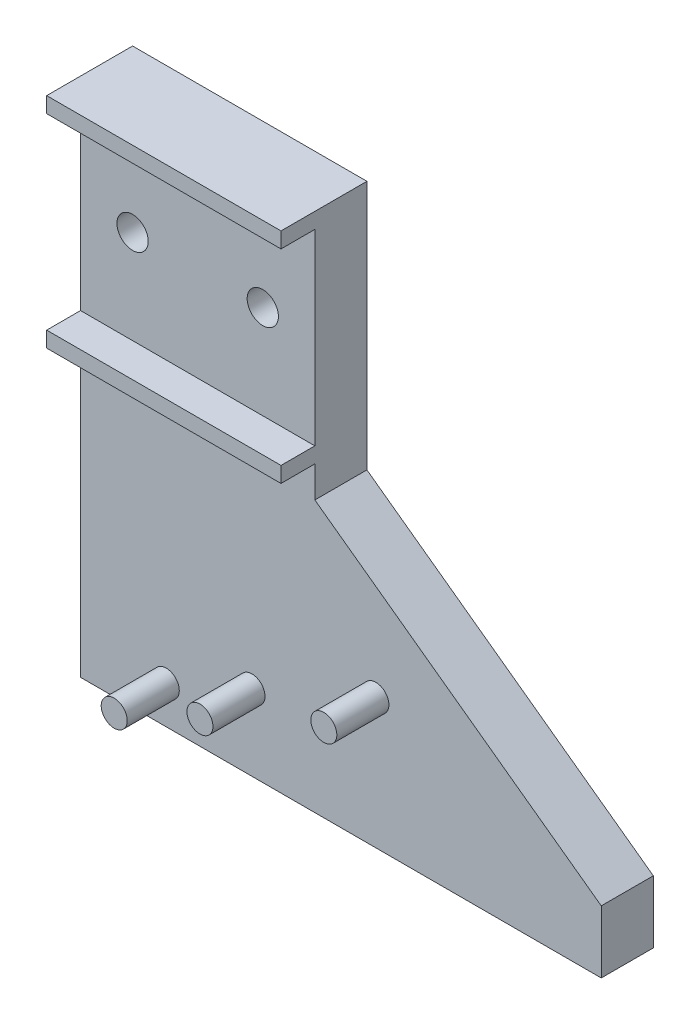
ISO-10303-21;
HEADER;
FILE_DESCRIPTION(('STEP AP214'),'2;1');
FILE_NAME('part.step','',(''),(''),'','','');
FILE_SCHEMA(('AUTOMOTIVE_DESIGN { 1 0 10303 214 1 1 1 1 }'));
ENDSEC;
DATA;
#1=APPLICATION_CONTEXT('core data for automotive mechanical design processes');
#2=APPLICATION_PROTOCOL_DEFINITION('international standard','automotive_design',2000,#1);
#3=PRODUCT_CONTEXT('',#1,'mechanical');
#4=PRODUCT('Part','Part','',(#3));
#5=PRODUCT_RELATED_PRODUCT_CATEGORY('part','',(#4));
#6=PRODUCT_DEFINITION_FORMATION('','',#4);
#7=PRODUCT_DEFINITION_CONTEXT('part definition',#1,'design');
#8=PRODUCT_DEFINITION('design','',#6,#7);
#9=PRODUCT_DEFINITION_SHAPE('','',#8);
#10=(LENGTH_UNIT() NAMED_UNIT(*) SI_UNIT(.MILLI.,.METRE.));
#11=(NAMED_UNIT(*) PLANE_ANGLE_UNIT() SI_UNIT($,.RADIAN.));
#12=(NAMED_UNIT(*) SI_UNIT($,.STERADIAN.) SOLID_ANGLE_UNIT());
#13=UNCERTAINTY_MEASURE_WITH_UNIT(LENGTH_MEASURE(1.E-05),#10,'distance_accuracy_value','');
#14=(GEOMETRIC_REPRESENTATION_CONTEXT(3) GLOBAL_UNCERTAINTY_ASSIGNED_CONTEXT((#13)) GLOBAL_UNIT_ASSIGNED_CONTEXT((#10,
#11,#12)) REPRESENTATION_CONTEXT('',''));
#15=CARTESIAN_POINT('',(0.,0.,0.));
#16=DIRECTION('',(0.,0.,1.));
#17=DIRECTION('',(1.,0.,0.));
#18=AXIS2_PLACEMENT_3D('',#15,#16,#17);
#19=CARTESIAN_POINT('',(0.,0.,0.));
#20=DIRECTION('',(0.,0.,1.));
#21=DIRECTION('',(1.,0.,0.));
#22=AXIS2_PLACEMENT_3D('',#19,#20,#21);
#23=PLANE('',#22);
#24=CARTESIAN_POINT('',(56.7206540357554,25.0353231606093,0.));
#25=DIRECTION('',(0.,0.,1.));
#26=DIRECTION('',(1.,0.,0.));
#27=AXIS2_PLACEMENT_3D('',#24,#25,#26);
#28=CIRCLE('',#27,2.5);
#29=CARTESIAN_POINT('',(59.2206540357554,25.0353231606093,0.));
#30=VERTEX_POINT('',#29);
#31=EDGE_CURVE('E249',#30,#30,#28,.T.);
#32=ORIENTED_EDGE('',*,*,#31,.F.);
#33=EDGE_LOOP('',(#32));
#34=FACE_BOUND('',#33,.T.);
#35=CARTESIAN_POINT('',(32.9345733110838,14.5366392545473,0.));
#36=DIRECTION('',(0.,0.,1.));
#37=DIRECTION('',(1.,0.,0.));
#38=AXIS2_PLACEMENT_3D('',#35,#36,#37);
#39=CIRCLE('',#38,2.5);
#40=CARTESIAN_POINT('',(35.4345733110838,14.5366392545473,0.));
#41=VERTEX_POINT('',#40);
#42=EDGE_CURVE('E243',#41,#41,#39,.T.);
#43=ORIENTED_EDGE('',*,*,#42,.F.);
#44=EDGE_LOOP('',(#43));
#45=FACE_BOUND('',#44,.T.);
#46=CARTESIAN_POINT('',(16.4672866555419,7.26831962727367,0.));
#47=DIRECTION('',(0.,0.,1.));
#48=DIRECTION('',(1.,0.,0.));
#49=AXIS2_PLACEMENT_3D('',#46,#47,#48);
#50=CIRCLE('',#49,2.5);
#51=CARTESIAN_POINT('',(18.9672866555419,7.26831962727367,0.));
#52=VERTEX_POINT('',#51);
#53=EDGE_CURVE('E237',#52,#52,#50,.T.);
#54=ORIENTED_EDGE('',*,*,#53,.F.);
#55=EDGE_LOOP('',(#54));
#56=FACE_BOUND('',#55,.T.);
#57=DIRECTION('',(0.,1.,0.));
#58=VECTOR('',#57,1.);
#59=CARTESIAN_POINT('',(45.,52.,0.));
#60=LINE('',#59,#58);
#61=CARTESIAN_POINT('',(45.,52.,0.));
#62=VERTEX_POINT('',#61);
#63=CARTESIAN_POINT('',(45.,58.,0.));
#64=VERTEX_POINT('',#63);
#65=EDGE_CURVE('E174',#62,#64,#60,.T.);
#66=ORIENTED_EDGE('',*,*,#65,.T.);
#67=DIRECTION('',(1.,0.,0.));
#68=VECTOR('',#67,1.);
#69=CARTESIAN_POINT('',(0.,58.,0.));
#70=LINE('',#69,#68);
#71=CARTESIAN_POINT('',(0.,58.,0.));
#72=VERTEX_POINT('',#71);
#73=EDGE_CURVE('E215',#72,#64,#70,.T.);
#74=ORIENTED_EDGE('',*,*,#73,.F.);
#75=DIRECTION('',(0.,-1.,0.));
#76=VECTOR('',#75,1.);
#77=CARTESIAN_POINT('',(0.,100.,0.));
#78=LINE('',#77,#76);
#79=CARTESIAN_POINT('',(0.,0.,0.));
#80=VERTEX_POINT('',#79);
#81=EDGE_CURVE('E147',#72,#80,#78,.T.);
#82=ORIENTED_EDGE('',*,*,#81,.T.);
#83=DIRECTION('',(1.,0.,0.));
#84=VECTOR('',#83,1.);
#85=CARTESIAN_POINT('',(0.,0.,0.));
#86=LINE('',#85,#84);
#87=CARTESIAN_POINT('',(100.,0.,0.));
#88=VERTEX_POINT('',#87);
#89=EDGE_CURVE('E191',#80,#88,#86,.T.);
#90=ORIENTED_EDGE('',*,*,#89,.T.);
#91=DIRECTION('',(0.,1.,0.));
#92=VECTOR('',#91,1.);
#93=CARTESIAN_POINT('',(100.,0.,0.));
#94=LINE('',#93,#92);
#95=CARTESIAN_POINT('',(100.,12.,0.));
#96=VERTEX_POINT('',#95);
#97=EDGE_CURVE('E194',#88,#96,#94,.T.);
#98=ORIENTED_EDGE('',*,*,#97,.T.);
#99=DIRECTION('',(-0.808736084303189,0.588171697675046,0.));
#100=VECTOR('',#99,1.);
#101=CARTESIAN_POINT('',(100.,12.,0.));
#102=LINE('',#101,#100);
#103=EDGE_CURVE('E197',#96,#62,#102,.T.);
#104=ORIENTED_EDGE('',*,*,#103,.T.);
#105=EDGE_LOOP('',(#66,#74,#82,#90,#98,#104));
#106=FACE_BOUND('',#105,.T.);
#107=ADVANCED_FACE('F33',(#34,#45,#56,#106),#23,.T.);
#108=CARTESIAN_POINT('',(10.,79.,0.));
#109=DIRECTION('',(0.,0.,1.));
#110=DIRECTION('',(1.,0.,0.));
#111=AXIS2_PLACEMENT_3D('',#108,#109,#110);
#112=CIRCLE('',#111,3.);
#113=CARTESIAN_POINT('',(13.,79.,0.));
#114=VERTEX_POINT('',#113);
#115=EDGE_CURVE('E221',#114,#114,#112,.T.);
#116=ORIENTED_EDGE('',*,*,#115,.F.);
#117=EDGE_LOOP('',(#116));
#118=FACE_BOUND('',#117,.T.);
#119=CARTESIAN_POINT('',(35.,79.,0.));
#120=DIRECTION('',(0.,0.,1.));
#121=DIRECTION('',(1.,0.,0.));
#122=AXIS2_PLACEMENT_3D('',#119,#120,#121);
#123=CIRCLE('',#122,3.);
#124=CARTESIAN_POINT('',(38.,79.,0.));
#125=VERTEX_POINT('',#124);
#126=EDGE_CURVE('E231',#125,#125,#123,.T.);
#127=ORIENTED_EDGE('',*,*,#126,.F.);
#128=EDGE_LOOP('',(#127));
#129=FACE_BOUND('',#128,.T.);
#130=CARTESIAN_POINT('',(0.,97.,0.));
#131=VERTEX_POINT('',#130);
#132=CARTESIAN_POINT('',(0.,61.,0.));
#133=VERTEX_POINT('',#132);
#134=EDGE_CURVE('E189',#131,#133,#78,.T.);
#135=ORIENTED_EDGE('',*,*,#134,.T.);
#136=DIRECTION('',(-1.,0.,0.));
#137=VECTOR('',#136,1.);
#138=CARTESIAN_POINT('',(0.,61.,0.));
#139=LINE('',#138,#137);
#140=CARTESIAN_POINT('',(45.,61.,0.));
#141=VERTEX_POINT('',#140);
#142=EDGE_CURVE('E143',#141,#133,#139,.T.);
#143=ORIENTED_EDGE('',*,*,#142,.F.);
#144=CARTESIAN_POINT('',(45.,97.,0.));
#145=VERTEX_POINT('',#144);
#146=EDGE_CURVE('E200',#141,#145,#60,.T.);
#147=ORIENTED_EDGE('',*,*,#146,.T.);
#148=DIRECTION('',(1.,0.,0.));
#149=VECTOR('',#148,1.);
#150=CARTESIAN_POINT('',(0.,97.,0.));
#151=LINE('',#150,#149);
#152=EDGE_CURVE('E58',#131,#145,#151,.T.);
#153=ORIENTED_EDGE('',*,*,#152,.F.);
#154=EDGE_LOOP('',(#135,#143,#147,#153));
#155=FACE_BOUND('',#154,.T.);
#156=ADVANCED_FACE('F266',(#118,#129,#155),#23,.T.);
#157=CARTESIAN_POINT('',(0.,100.,-10.));
#158=DIRECTION('',(-1.,0.,0.));
#159=DIRECTION('',(0.,0.,1.));
#160=AXIS2_PLACEMENT_3D('',#157,#158,#159);
#161=PLANE('',#160);
#162=ORIENTED_EDGE('',*,*,#134,.F.);
#163=DIRECTION('',(0.,0.,-1.));
#164=VECTOR('',#163,1.);
#165=CARTESIAN_POINT('',(0.,97.,6.5));
#166=LINE('',#165,#164);
#167=CARTESIAN_POINT('',(0.,97.,6.5));
#168=VERTEX_POINT('',#167);
#169=EDGE_CURVE('E167',#168,#131,#166,.T.);
#170=ORIENTED_EDGE('',*,*,#169,.F.);
#171=DIRECTION('',(0.,-1.,0.));
#172=VECTOR('',#171,1.);
#173=CARTESIAN_POINT('',(0.,100.,6.5));
#174=LINE('',#173,#172);
#175=CARTESIAN_POINT('',(0.,100.,6.5));
#176=VERTEX_POINT('',#175);
#177=EDGE_CURVE('E149',#176,#168,#174,.T.);
#178=ORIENTED_EDGE('',*,*,#177,.F.);
#179=DIRECTION('',(0.,0.,1.));
#180=VECTOR('',#179,1.);
#181=CARTESIAN_POINT('',(0.,100.,-10.));
#182=LINE('',#181,#180);
#183=CARTESIAN_POINT('',(0.,100.,-10.));
#184=VERTEX_POINT('',#183);
#185=EDGE_CURVE('E11',#184,#176,#182,.T.);
#186=ORIENTED_EDGE('',*,*,#185,.F.);
#187=DIRECTION('',(0.,-1.,0.));
#188=VECTOR('',#187,1.);
#189=CARTESIAN_POINT('',(0.,100.,-10.));
#190=LINE('',#189,#188);
#191=CARTESIAN_POINT('',(0.,0.,-10.));
#192=VERTEX_POINT('',#191);
#193=EDGE_CURVE('E170',#184,#192,#190,.T.);
#194=ORIENTED_EDGE('',*,*,#193,.T.);
#195=DIRECTION('',(0.,0.,1.));
#196=VECTOR('',#195,1.);
#197=CARTESIAN_POINT('',(0.,0.,-10.));
#198=LINE('',#197,#196);
#199=EDGE_CURVE('E37',#192,#80,#198,.T.);
#200=ORIENTED_EDGE('',*,*,#199,.T.);
#201=ORIENTED_EDGE('',*,*,#81,.F.);
#202=DIRECTION('',(0.,0.,-1.));
#203=VECTOR('',#202,1.);
#204=CARTESIAN_POINT('',(0.,58.,6.5));
#205=LINE('',#204,#203);
#206=CARTESIAN_POINT('',(0.,58.,6.5));
#207=VERTEX_POINT('',#206);
#208=EDGE_CURVE('E128',#207,#72,#205,.T.);
#209=ORIENTED_EDGE('',*,*,#208,.F.);
#210=DIRECTION('',(0.,-1.,0.));
#211=VECTOR('',#210,1.);
#212=CARTESIAN_POINT('',(0.,61.,6.5));
#213=LINE('',#212,#211);
#214=CARTESIAN_POINT('',(0.,61.,6.5));
#215=VERTEX_POINT('',#214);
#216=EDGE_CURVE('E135',#215,#207,#213,.T.);
#217=ORIENTED_EDGE('',*,*,#216,.F.);
#218=DIRECTION('',(0.,0.,-1.));
#219=VECTOR('',#218,1.);
#220=CARTESIAN_POINT('',(0.,61.,6.5));
#221=LINE('',#220,#219);
#222=EDGE_CURVE('E226',#215,#133,#221,.T.);
#223=ORIENTED_EDGE('',*,*,#222,.T.);
#224=EDGE_LOOP('',(#162,#170,#178,#186,#194,#200,#201,#209,#217,#223));
#225=FACE_BOUND('',#224,.T.);
#226=ADVANCED_FACE('F35',(#225),#161,.T.);
#227=CARTESIAN_POINT('',(45.,100.,-10.));
#228=DIRECTION('',(0.,1.,0.));
#229=DIRECTION('',(0.,0.,1.));
#230=AXIS2_PLACEMENT_3D('',#227,#228,#229);
#231=PLANE('',#230);
#232=ORIENTED_EDGE('',*,*,#185,.T.);
#233=DIRECTION('',(-1.,0.,0.));
#234=VECTOR('',#233,1.);
#235=CARTESIAN_POINT('',(0.,100.,6.5));
#236=LINE('',#235,#234);
#237=CARTESIAN_POINT('',(45.,100.,6.5));
#238=VERTEX_POINT('',#237);
#239=EDGE_CURVE('E161',#238,#176,#236,.T.);
#240=ORIENTED_EDGE('',*,*,#239,.F.);
#241=DIRECTION('',(0.,0.,1.));
#242=VECTOR('',#241,1.);
#243=CARTESIAN_POINT('',(45.,100.,-10.));
#244=LINE('',#243,#242);
#245=CARTESIAN_POINT('',(45.,100.,-10.));
#246=VERTEX_POINT('',#245);
#247=EDGE_CURVE('E42',#246,#238,#244,.T.);
#248=ORIENTED_EDGE('',*,*,#247,.F.);
#249=DIRECTION('',(-1.,0.,0.));
#250=VECTOR('',#249,1.);
#251=CARTESIAN_POINT('',(45.,100.,-10.));
#252=LINE('',#251,#250);
#253=EDGE_CURVE('E186',#246,#184,#252,.T.);
#254=ORIENTED_EDGE('',*,*,#253,.T.);
#255=EDGE_LOOP('',(#232,#240,#248,#254));
#256=FACE_BOUND('',#255,.T.);
#257=ADVANCED_FACE('F313',(#256),#231,.T.);
#258=CARTESIAN_POINT('',(45.,52.,-10.));
#259=DIRECTION('',(1.,0.,0.));
#260=DIRECTION('',(0.,0.,-1.));
#261=AXIS2_PLACEMENT_3D('',#258,#259,#260);
#262=PLANE('',#261);
#263=ORIENTED_EDGE('',*,*,#65,.F.);
#264=DIRECTION('',(0.,0.,1.));
#265=VECTOR('',#264,1.);
#266=CARTESIAN_POINT('',(45.,52.,-10.));
#267=LINE('',#266,#265);
#268=CARTESIAN_POINT('',(45.,52.,-10.));
#269=VERTEX_POINT('',#268);
#270=EDGE_CURVE('E204',#269,#62,#267,.T.);
#271=ORIENTED_EDGE('',*,*,#270,.F.);
#272=DIRECTION('',(0.,1.,0.));
#273=VECTOR('',#272,1.);
#274=CARTESIAN_POINT('',(45.,52.,-10.));
#275=LINE('',#274,#273);
#276=EDGE_CURVE('E183',#269,#246,#275,.T.);
#277=ORIENTED_EDGE('',*,*,#276,.T.);
#278=ORIENTED_EDGE('',*,*,#247,.T.);
#279=DIRECTION('',(0.,1.,0.));
#280=VECTOR('',#279,1.);
#281=CARTESIAN_POINT('',(45.,100.,6.5));
#282=LINE('',#281,#280);
#283=CARTESIAN_POINT('',(45.,97.,6.5));
#284=VERTEX_POINT('',#283);
#285=EDGE_CURVE('E158',#284,#238,#282,.T.);
#286=ORIENTED_EDGE('',*,*,#285,.F.);
#287=DIRECTION('',(0.,0.,-1.));
#288=VECTOR('',#287,1.);
#289=CARTESIAN_POINT('',(45.,97.,6.5));
#290=LINE('',#289,#288);
#291=EDGE_CURVE('E163',#284,#145,#290,.T.);
#292=ORIENTED_EDGE('',*,*,#291,.T.);
#293=ORIENTED_EDGE('',*,*,#146,.F.);
#294=DIRECTION('',(0.,0.,-1.));
#295=VECTOR('',#294,1.);
#296=CARTESIAN_POINT('',(45.,61.,6.5));
#297=LINE('',#296,#295);
#298=CARTESIAN_POINT('',(45.,61.,6.5));
#299=VERTEX_POINT('',#298);
#300=EDGE_CURVE('E50',#299,#141,#297,.T.);
#301=ORIENTED_EDGE('',*,*,#300,.F.);
#302=DIRECTION('',(0.,1.,0.));
#303=VECTOR('',#302,1.);
#304=CARTESIAN_POINT('',(45.,61.,6.5));
#305=LINE('',#304,#303);
#306=CARTESIAN_POINT('',(45.,58.,6.5));
#307=VERTEX_POINT('',#306);
#308=EDGE_CURVE('E134',#307,#299,#305,.T.);
#309=ORIENTED_EDGE('',*,*,#308,.F.);
#310=DIRECTION('',(0.,0.,-1.));
#311=VECTOR('',#310,1.);
#312=CARTESIAN_POINT('',(45.,58.,6.5));
#313=LINE('',#312,#311);
#314=EDGE_CURVE('E131',#307,#64,#313,.T.);
#315=ORIENTED_EDGE('',*,*,#314,.T.);
#316=EDGE_LOOP('',(#263,#271,#277,#278,#286,#292,#293,#301,#309,#315));
#317=FACE_BOUND('',#316,.T.);
#318=ADVANCED_FACE('F316',(#317),#262,.T.);
#319=CARTESIAN_POINT('',(100.,12.,-10.));
#320=DIRECTION('',(0.588171697675046,0.808736084303189,0.));
#321=DIRECTION('',(-0.808736084303189,0.588171697675046,0.));
#322=AXIS2_PLACEMENT_3D('',#319,#320,#321);
#323=PLANE('',#322);
#324=ORIENTED_EDGE('',*,*,#103,.F.);
#325=DIRECTION('',(0.,0.,1.));
#326=VECTOR('',#325,1.);
#327=CARTESIAN_POINT('',(100.,12.,-10.));
#328=LINE('',#327,#326);
#329=CARTESIAN_POINT('',(100.,12.,-10.));
#330=VERTEX_POINT('',#329);
#331=EDGE_CURVE('E206',#330,#96,#328,.T.);
#332=ORIENTED_EDGE('',*,*,#331,.F.);
#333=DIRECTION('',(-0.808736084303189,0.588171697675046,0.));
#334=VECTOR('',#333,1.);
#335=CARTESIAN_POINT('',(100.,12.,-10.));
#336=LINE('',#335,#334);
#337=EDGE_CURVE('E180',#330,#269,#336,.T.);
#338=ORIENTED_EDGE('',*,*,#337,.T.);
#339=ORIENTED_EDGE('',*,*,#270,.T.);
#340=EDGE_LOOP('',(#324,#332,#338,#339));
#341=FACE_BOUND('',#340,.T.);
#342=ADVANCED_FACE('F320',(#341),#323,.T.);
#343=CARTESIAN_POINT('',(100.,0.,-10.));
#344=DIRECTION('',(1.,0.,0.));
#345=DIRECTION('',(0.,0.,-1.));
#346=AXIS2_PLACEMENT_3D('',#343,#344,#345);
#347=PLANE('',#346);
#348=ORIENTED_EDGE('',*,*,#97,.F.);
#349=DIRECTION('',(0.,0.,1.));
#350=VECTOR('',#349,1.);
#351=CARTESIAN_POINT('',(100.,0.,-10.));
#352=LINE('',#351,#350);
#353=CARTESIAN_POINT('',(100.,0.,-10.));
#354=VERTEX_POINT('',#353);
#355=EDGE_CURVE('E207',#354,#88,#352,.T.);
#356=ORIENTED_EDGE('',*,*,#355,.F.);
#357=DIRECTION('',(0.,1.,0.));
#358=VECTOR('',#357,1.);
#359=CARTESIAN_POINT('',(100.,0.,-10.));
#360=LINE('',#359,#358);
#361=EDGE_CURVE('E177',#354,#330,#360,.T.);
#362=ORIENTED_EDGE('',*,*,#361,.T.);
#363=ORIENTED_EDGE('',*,*,#331,.T.);
#364=EDGE_LOOP('',(#348,#356,#362,#363));
#365=FACE_BOUND('',#364,.T.);
#366=ADVANCED_FACE('F324',(#365),#347,.T.);
#367=CARTESIAN_POINT('',(0.,0.,-10.));
#368=DIRECTION('',(0.,-1.,0.));
#369=DIRECTION('',(0.,0.,-1.));
#370=AXIS2_PLACEMENT_3D('',#367,#368,#369);
#371=PLANE('',#370);
#372=ORIENTED_EDGE('',*,*,#89,.F.);
#373=ORIENTED_EDGE('',*,*,#199,.F.);
#374=DIRECTION('',(1.,0.,0.));
#375=VECTOR('',#374,1.);
#376=CARTESIAN_POINT('',(0.,0.,-10.));
#377=LINE('',#376,#375);
#378=EDGE_CURVE('E173',#192,#354,#377,.T.);
#379=ORIENTED_EDGE('',*,*,#378,.T.);
#380=ORIENTED_EDGE('',*,*,#355,.T.);
#381=EDGE_LOOP('',(#372,#373,#379,#380));
#382=FACE_BOUND('',#381,.T.);
#383=ADVANCED_FACE('F213',(#382),#371,.T.);
#384=CARTESIAN_POINT('',(0.,0.,-10.));
#385=DIRECTION('',(0.,0.,1.));
#386=DIRECTION('',(1.,0.,0.));
#387=AXIS2_PLACEMENT_3D('',#384,#385,#386);
#388=PLANE('',#387);
#389=CARTESIAN_POINT('',(10.,79.,-10.));
#390=DIRECTION('',(0.,0.,1.));
#391=DIRECTION('',(1.,0.,0.));
#392=AXIS2_PLACEMENT_3D('',#389,#390,#391);
#393=CIRCLE('',#392,3.);
#394=CARTESIAN_POINT('',(13.,79.,-10.));
#395=VERTEX_POINT('',#394);
#396=EDGE_CURVE('E217',#395,#395,#393,.F.);
#397=ORIENTED_EDGE('',*,*,#396,.F.);
#398=EDGE_LOOP('',(#397));
#399=FACE_BOUND('',#398,.T.);
#400=CARTESIAN_POINT('',(35.,79.,-10.));
#401=DIRECTION('',(0.,0.,1.));
#402=DIRECTION('',(1.,0.,0.));
#403=AXIS2_PLACEMENT_3D('',#400,#401,#402);
#404=CIRCLE('',#403,3.);
#405=CARTESIAN_POINT('',(38.,79.,-10.));
#406=VERTEX_POINT('',#405);
#407=EDGE_CURVE('E228',#406,#406,#404,.F.);
#408=ORIENTED_EDGE('',*,*,#407,.F.);
#409=EDGE_LOOP('',(#408));
#410=FACE_BOUND('',#409,.T.);
#411=ORIENTED_EDGE('',*,*,#193,.F.);
#412=ORIENTED_EDGE('',*,*,#253,.F.);
#413=ORIENTED_EDGE('',*,*,#276,.F.);
#414=ORIENTED_EDGE('',*,*,#337,.F.);
#415=ORIENTED_EDGE('',*,*,#361,.F.);
#416=ORIENTED_EDGE('',*,*,#378,.F.);
#417=EDGE_LOOP('',(#411,#412,#413,#414,#415,#416));
#418=FACE_BOUND('',#417,.T.);
#419=ADVANCED_FACE('F308',(#399,#410,#418),#388,.F.);
#420=CARTESIAN_POINT('',(0.,97.,6.5));
#421=DIRECTION('',(0.,1.,0.));
#422=DIRECTION('',(0.,0.,1.));
#423=AXIS2_PLACEMENT_3D('',#420,#421,#422);
#424=PLANE('',#423);
#425=ORIENTED_EDGE('',*,*,#152,.T.);
#426=ORIENTED_EDGE('',*,*,#291,.F.);
#427=DIRECTION('',(1.,0.,0.));
#428=VECTOR('',#427,1.);
#429=CARTESIAN_POINT('',(0.,97.,6.5));
#430=LINE('',#429,#428);
#431=EDGE_CURVE('E156',#168,#284,#430,.T.);
#432=ORIENTED_EDGE('',*,*,#431,.F.);
#433=ORIENTED_EDGE('',*,*,#169,.T.);
#434=EDGE_LOOP('',(#425,#426,#432,#433));
#435=FACE_BOUND('',#434,.T.);
#436=ADVANCED_FACE('F304',(#435),#424,.F.);
#437=CARTESIAN_POINT('',(0.,0.,6.5));
#438=DIRECTION('',(0.,0.,1.));
#439=DIRECTION('',(1.,0.,0.));
#440=AXIS2_PLACEMENT_3D('',#437,#438,#439);
#441=PLANE('',#440);
#442=ORIENTED_EDGE('',*,*,#177,.T.);
#443=ORIENTED_EDGE('',*,*,#431,.T.);
#444=ORIENTED_EDGE('',*,*,#285,.T.);
#445=ORIENTED_EDGE('',*,*,#239,.T.);
#446=EDGE_LOOP('',(#442,#443,#444,#445));
#447=FACE_BOUND('',#446,.T.);
#448=ADVANCED_FACE('F301',(#447),#441,.T.);
#449=CARTESIAN_POINT('',(0.,58.,6.5));
#450=DIRECTION('',(0.,1.,0.));
#451=DIRECTION('',(0.,0.,1.));
#452=AXIS2_PLACEMENT_3D('',#449,#450,#451);
#453=PLANE('',#452);
#454=ORIENTED_EDGE('',*,*,#73,.T.);
#455=ORIENTED_EDGE('',*,*,#314,.F.);
#456=DIRECTION('',(1.,0.,0.));
#457=VECTOR('',#456,1.);
#458=CARTESIAN_POINT('',(0.,58.,6.5));
#459=LINE('',#458,#457);
#460=EDGE_CURVE('E124',#207,#307,#459,.T.);
#461=ORIENTED_EDGE('',*,*,#460,.F.);
#462=ORIENTED_EDGE('',*,*,#208,.T.);
#463=EDGE_LOOP('',(#454,#455,#461,#462));
#464=FACE_BOUND('',#463,.T.);
#465=ADVANCED_FACE('F126',(#464),#453,.F.);
#466=CARTESIAN_POINT('',(0.,61.,6.5));
#467=DIRECTION('',(0.,-1.,0.));
#468=DIRECTION('',(1.,0.,0.));
#469=AXIS2_PLACEMENT_3D('',#466,#467,#468);
#470=PLANE('',#469);
#471=ORIENTED_EDGE('',*,*,#142,.T.);
#472=ORIENTED_EDGE('',*,*,#222,.F.);
#473=DIRECTION('',(-1.,0.,0.));
#474=VECTOR('',#473,1.);
#475=CARTESIAN_POINT('',(0.,61.,6.5));
#476=LINE('',#475,#474);
#477=EDGE_CURVE('E139',#299,#215,#476,.T.);
#478=ORIENTED_EDGE('',*,*,#477,.F.);
#479=ORIENTED_EDGE('',*,*,#300,.T.);
#480=EDGE_LOOP('',(#471,#472,#478,#479));
#481=FACE_BOUND('',#480,.T.);
#482=ADVANCED_FACE('F296',(#481),#470,.F.);
#483=CARTESIAN_POINT('',(0.,0.,6.5));
#484=DIRECTION('',(0.,0.,1.));
#485=DIRECTION('',(1.,0.,0.));
#486=AXIS2_PLACEMENT_3D('',#483,#484,#485);
#487=PLANE('',#486);
#488=ORIENTED_EDGE('',*,*,#216,.T.);
#489=ORIENTED_EDGE('',*,*,#460,.T.);
#490=ORIENTED_EDGE('',*,*,#308,.T.);
#491=ORIENTED_EDGE('',*,*,#477,.T.);
#492=EDGE_LOOP('',(#488,#489,#490,#491));
#493=FACE_BOUND('',#492,.T.);
#494=ADVANCED_FACE('F138',(#493),#487,.T.);
#495=CARTESIAN_POINT('',(35.,79.,-18.4852813742386));
#496=DIRECTION('',(0.,0.,1.));
#497=DIRECTION('',(1.,0.,0.));
#498=AXIS2_PLACEMENT_3D('',#495,#496,#497);
#499=CYLINDRICAL_SURFACE('',#498,3.);
#500=ORIENTED_EDGE('',*,*,#407,.T.);
#501=EDGE_LOOP('',(#500));
#502=FACE_BOUND('',#501,.T.);
#503=ORIENTED_EDGE('',*,*,#126,.T.);
#504=EDGE_LOOP('',(#503));
#505=FACE_BOUND('',#504,.T.);
#506=ADVANCED_FACE('F285',(#502,#505),#499,.F.);
#507=CARTESIAN_POINT('',(10.,79.,-18.4852813742386));
#508=DIRECTION('',(0.,0.,1.));
#509=DIRECTION('',(1.,0.,0.));
#510=AXIS2_PLACEMENT_3D('',#507,#508,#509);
#511=CYLINDRICAL_SURFACE('',#510,3.);
#512=ORIENTED_EDGE('',*,*,#396,.T.);
#513=EDGE_LOOP('',(#512));
#514=FACE_BOUND('',#513,.T.);
#515=ORIENTED_EDGE('',*,*,#115,.T.);
#516=EDGE_LOOP('',(#515));
#517=FACE_BOUND('',#516,.T.);
#518=ADVANCED_FACE('F275',(#514,#517),#511,.F.);
#519=CARTESIAN_POINT('',(16.4672866555419,7.26831962727367,10.));
#520=DIRECTION('',(0.,0.,-1.));
#521=DIRECTION('',(-1.,0.,0.));
#522=AXIS2_PLACEMENT_3D('',#519,#520,#521);
#523=CYLINDRICAL_SURFACE('',#522,2.5);
#524=CARTESIAN_POINT('',(16.4672866555419,7.26831962727367,10.));
#525=DIRECTION('',(0.,0.,1.));
#526=DIRECTION('',(1.,0.,0.));
#527=AXIS2_PLACEMENT_3D('',#524,#525,#526);
#528=CIRCLE('',#527,2.5);
#529=CARTESIAN_POINT('',(18.9672866555419,7.26831962727367,10.));
#530=VERTEX_POINT('',#529);
#531=EDGE_CURVE('E233',#530,#530,#528,.T.);
#532=ORIENTED_EDGE('',*,*,#531,.F.);
#533=EDGE_LOOP('',(#532));
#534=FACE_BOUND('',#533,.T.);
#535=ORIENTED_EDGE('',*,*,#53,.T.);
#536=EDGE_LOOP('',(#535));
#537=FACE_BOUND('',#536,.T.);
#538=ADVANCED_FACE('F272',(#534,#537),#523,.T.);
#539=CARTESIAN_POINT('',(16.4672866555419,7.26831962727367,10.));
#540=DIRECTION('',(0.,0.,1.));
#541=DIRECTION('',(1.,0.,0.));
#542=AXIS2_PLACEMENT_3D('',#539,#540,#541);
#543=PLANE('',#542);
#544=ORIENTED_EDGE('',*,*,#531,.T.);
#545=EDGE_LOOP('',(#544));
#546=FACE_BOUND('',#545,.T.);
#547=ADVANCED_FACE('F274',(#546),#543,.T.);
#548=CARTESIAN_POINT('',(32.9345733110838,14.5366392545473,10.));
#549=DIRECTION('',(0.,0.,-1.));
#550=DIRECTION('',(-1.,0.,0.));
#551=AXIS2_PLACEMENT_3D('',#548,#549,#550);
#552=CYLINDRICAL_SURFACE('',#551,2.5);
#553=CARTESIAN_POINT('',(32.9345733110838,14.5366392545473,10.));
#554=DIRECTION('',(0.,0.,1.));
#555=DIRECTION('',(1.,0.,0.));
#556=AXIS2_PLACEMENT_3D('',#553,#554,#555);
#557=CIRCLE('',#556,2.5);
#558=CARTESIAN_POINT('',(35.4345733110838,14.5366392545473,10.));
#559=VERTEX_POINT('',#558);
#560=EDGE_CURVE('E240',#559,#559,#557,.T.);
#561=ORIENTED_EDGE('',*,*,#560,.F.);
#562=EDGE_LOOP('',(#561));
#563=FACE_BOUND('',#562,.T.);
#564=ORIENTED_EDGE('',*,*,#42,.T.);
#565=EDGE_LOOP('',(#564));
#566=FACE_BOUND('',#565,.T.);
#567=ADVANCED_FACE('F282',(#563,#566),#552,.T.);
#568=CARTESIAN_POINT('',(32.9345733110838,14.5366392545473,10.));
#569=DIRECTION('',(0.,0.,1.));
#570=DIRECTION('',(1.,0.,0.));
#571=AXIS2_PLACEMENT_3D('',#568,#569,#570);
#572=PLANE('',#571);
#573=ORIENTED_EDGE('',*,*,#560,.T.);
#574=EDGE_LOOP('',(#573));
#575=FACE_BOUND('',#574,.T.);
#576=ADVANCED_FACE('F260',(#575),#572,.T.);
#577=CARTESIAN_POINT('',(56.7206540357554,25.0353231606093,10.));
#578=DIRECTION('',(0.,0.,-1.));
#579=DIRECTION('',(-1.,0.,0.));
#580=AXIS2_PLACEMENT_3D('',#577,#578,#579);
#581=CYLINDRICAL_SURFACE('',#580,2.5);
#582=CARTESIAN_POINT('',(56.7206540357554,25.0353231606093,10.));
#583=DIRECTION('',(0.,0.,1.));
#584=DIRECTION('',(1.,0.,0.));
#585=AXIS2_PLACEMENT_3D('',#582,#583,#584);
#586=CIRCLE('',#585,2.5);
#587=CARTESIAN_POINT('',(59.2206540357554,25.0353231606093,10.));
#588=VERTEX_POINT('',#587);
#589=EDGE_CURVE('E246',#588,#588,#586,.T.);
#590=ORIENTED_EDGE('',*,*,#589,.F.);
#591=EDGE_LOOP('',(#590));
#592=FACE_BOUND('',#591,.T.);
#593=ORIENTED_EDGE('',*,*,#31,.T.);
#594=EDGE_LOOP('',(#593));
#595=FACE_BOUND('',#594,.T.);
#596=ADVANCED_FACE('F257',(#592,#595),#581,.T.);
#597=CARTESIAN_POINT('',(56.7206540357554,25.0353231606093,10.));
#598=DIRECTION('',(0.,0.,1.));
#599=DIRECTION('',(1.,0.,0.));
#600=AXIS2_PLACEMENT_3D('',#597,#598,#599);
#601=PLANE('',#600);
#602=ORIENTED_EDGE('',*,*,#589,.T.);
#603=EDGE_LOOP('',(#602));
#604=FACE_BOUND('',#603,.T.);
#605=ADVANCED_FACE('F255',(#604),#601,.T.);
#606=CLOSED_SHELL('',(#107,#156,#226,#257,#318,#342,#366,#383,#419,#436,#448,#465,#482,#494,
#506,#518,#538,#547,#567,#576,#596,#605));
#607=MANIFOLD_SOLID_BREP('B2',#606);
#608=ADVANCED_BREP_SHAPE_REPRESENTATION('',(#18,#607),#14);
#609=SHAPE_DEFINITION_REPRESENTATION(#9,#608);
ENDSEC;
END-ISO-10303-21;
